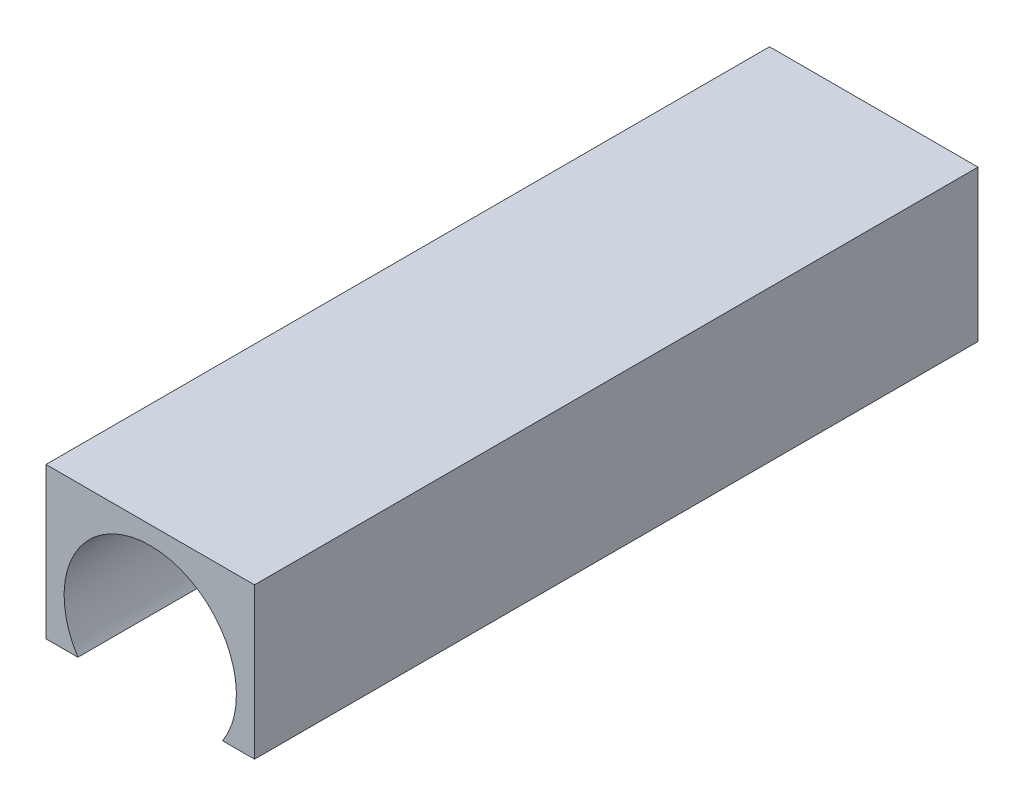
ISO-10303-21;
HEADER;
FILE_DESCRIPTION(('STEP AP214'),'2;1');
FILE_NAME('part.step','',(''),(''),'','','');
FILE_SCHEMA(('AUTOMOTIVE_DESIGN { 1 0 10303 214 1 1 1 1 }'));
ENDSEC;
DATA;
#1=APPLICATION_CONTEXT('core data for automotive mechanical design processes');
#2=APPLICATION_PROTOCOL_DEFINITION('international standard','automotive_design',2000,#1);
#3=PRODUCT_CONTEXT('',#1,'mechanical');
#4=PRODUCT('Part','Part','',(#3));
#5=PRODUCT_RELATED_PRODUCT_CATEGORY('part','',(#4));
#6=PRODUCT_DEFINITION_FORMATION('','',#4);
#7=PRODUCT_DEFINITION_CONTEXT('part definition',#1,'design');
#8=PRODUCT_DEFINITION('design','',#6,#7);
#9=PRODUCT_DEFINITION_SHAPE('','',#8);
#10=(LENGTH_UNIT() NAMED_UNIT(*) SI_UNIT(.MILLI.,.METRE.));
#11=(NAMED_UNIT(*) PLANE_ANGLE_UNIT() SI_UNIT($,.RADIAN.));
#12=(NAMED_UNIT(*) SI_UNIT($,.STERADIAN.) SOLID_ANGLE_UNIT());
#13=UNCERTAINTY_MEASURE_WITH_UNIT(LENGTH_MEASURE(1.E-05),#10,'distance_accuracy_value','');
#14=(GEOMETRIC_REPRESENTATION_CONTEXT(3) GLOBAL_UNCERTAINTY_ASSIGNED_CONTEXT((#13)) GLOBAL_UNIT_ASSIGNED_CONTEXT((#10,
#11,#12)) REPRESENTATION_CONTEXT('',''));
#15=CARTESIAN_POINT('',(0.,0.,0.));
#16=DIRECTION('',(0.,0.,1.));
#17=DIRECTION('',(1.,0.,0.));
#18=AXIS2_PLACEMENT_3D('',#15,#16,#17);
#19=CARTESIAN_POINT('',(0.,0.,12.7));
#20=DIRECTION('',(1.,0.,0.));
#21=DIRECTION('',(0.,0.,-1.));
#22=AXIS2_PLACEMENT_3D('',#19,#20,#21);
#23=PLANE('',#22);
#24=DIRECTION('',(0.,-1.,0.));
#25=VECTOR('',#24,1.);
#26=CARTESIAN_POINT('',(0.,0.,-12.7));
#27=LINE('',#26,#25);
#28=CARTESIAN_POINT('',(0.,5.30287096267479,-12.7));
#29=VERTEX_POINT('',#28);
#30=CARTESIAN_POINT('',(0.,0.,-12.7));
#31=VERTEX_POINT('',#30);
#32=EDGE_CURVE('E128',#29,#31,#27,.T.);
#33=ORIENTED_EDGE('',*,*,#32,.T.);
#34=DIRECTION('',(0.,0.,-1.));
#35=VECTOR('',#34,1.);
#36=CARTESIAN_POINT('',(0.,0.,12.7));
#37=LINE('',#36,#35);
#38=CARTESIAN_POINT('',(0.,0.,12.7));
#39=VERTEX_POINT('',#38);
#40=EDGE_CURVE('E11',#39,#31,#37,.T.);
#41=ORIENTED_EDGE('',*,*,#40,.F.);
#42=DIRECTION('',(0.,-1.,0.));
#43=VECTOR('',#42,1.);
#44=CARTESIAN_POINT('',(0.,0.,12.7));
#45=LINE('',#44,#43);
#46=CARTESIAN_POINT('',(0.,5.30287096267479,12.7));
#47=VERTEX_POINT('',#46);
#48=EDGE_CURVE('E144',#47,#39,#45,.T.);
#49=ORIENTED_EDGE('',*,*,#48,.F.);
#50=DIRECTION('',(0.,0.,-1.));
#51=VECTOR('',#50,1.);
#52=CARTESIAN_POINT('',(0.,5.30287096267479,12.7));
#53=LINE('',#52,#51);
#54=EDGE_CURVE('E124',#47,#29,#53,.T.);
#55=ORIENTED_EDGE('',*,*,#54,.T.);
#56=EDGE_LOOP('',(#33,#41,#49,#55));
#57=FACE_BOUND('',#56,.T.);
#58=ADVANCED_FACE('F39',(#57),#23,.F.);
#59=CARTESIAN_POINT('',(0.,0.,12.7));
#60=DIRECTION('',(0.,1.,0.));
#61=DIRECTION('',(0.,0.,1.));
#62=AXIS2_PLACEMENT_3D('',#59,#60,#61);
#63=PLANE('',#62);
#64=DIRECTION('',(1.,0.,0.));
#65=VECTOR('',#64,1.);
#66=CARTESIAN_POINT('',(0.,0.,-12.7));
#67=LINE('',#66,#65);
#68=CARTESIAN_POINT('',(1.12,0.,-12.7));
#69=VERTEX_POINT('',#68);
#70=EDGE_CURVE('E132',#31,#69,#67,.T.);
#71=ORIENTED_EDGE('',*,*,#70,.T.);
#72=DIRECTION('',(0.,0.,-1.));
#73=VECTOR('',#72,1.);
#74=CARTESIAN_POINT('',(1.12,0.,12.7));
#75=LINE('',#74,#73);
#76=CARTESIAN_POINT('',(1.12,0.,12.7));
#77=VERTEX_POINT('',#76);
#78=EDGE_CURVE('E48',#77,#69,#75,.T.);
#79=ORIENTED_EDGE('',*,*,#78,.F.);
#80=DIRECTION('',(1.,0.,0.));
#81=VECTOR('',#80,1.);
#82=CARTESIAN_POINT('',(0.,0.,12.7));
#83=LINE('',#82,#81);
#84=EDGE_CURVE('E93',#39,#77,#83,.T.);
#85=ORIENTED_EDGE('',*,*,#84,.F.);
#86=ORIENTED_EDGE('',*,*,#40,.T.);
#87=EDGE_LOOP('',(#71,#79,#85,#86));
#88=FACE_BOUND('',#87,.T.);
#89=ADVANCED_FACE('F172',(#88),#63,.F.);
#90=CARTESIAN_POINT('',(3.66,1.64287096267479,12.7));
#91=DIRECTION('',(0.,0.,-1.));
#92=DIRECTION('',(-1.,0.,0.));
#93=AXIS2_PLACEMENT_3D('',#90,#91,#92);
#94=CYLINDRICAL_SURFACE('',#93,3.025);
#95=CARTESIAN_POINT('',(3.66,1.64287096267479,-12.7));
#96=DIRECTION('',(0.,0.,-1.));
#97=DIRECTION('',(-1.,0.,0.));
#98=AXIS2_PLACEMENT_3D('',#95,#96,#97);
#99=CIRCLE('',#98,3.025);
#100=CARTESIAN_POINT('',(6.2,0.,-12.7));
#101=VERTEX_POINT('',#100);
#102=EDGE_CURVE('E135',#69,#101,#99,.T.);
#103=ORIENTED_EDGE('',*,*,#102,.T.);
#104=DIRECTION('',(0.,0.,-1.));
#105=VECTOR('',#104,1.);
#106=CARTESIAN_POINT('',(6.2,0.,12.7));
#107=LINE('',#106,#105);
#108=CARTESIAN_POINT('',(6.2,0.,12.7));
#109=VERTEX_POINT('',#108);
#110=EDGE_CURVE('E117',#109,#101,#107,.T.);
#111=ORIENTED_EDGE('',*,*,#110,.F.);
#112=CARTESIAN_POINT('',(3.66,1.64287096267479,12.7));
#113=DIRECTION('',(0.,0.,-1.));
#114=DIRECTION('',(-1.,0.,0.));
#115=AXIS2_PLACEMENT_3D('',#112,#113,#114);
#116=CIRCLE('',#115,3.025);
#117=EDGE_CURVE('E106',#77,#109,#116,.T.);
#118=ORIENTED_EDGE('',*,*,#117,.F.);
#119=ORIENTED_EDGE('',*,*,#78,.T.);
#120=EDGE_LOOP('',(#103,#111,#118,#119));
#121=FACE_BOUND('',#120,.T.);
#122=ADVANCED_FACE('F154',(#121),#94,.F.);
#123=CARTESIAN_POINT('',(6.2,0.,12.7));
#124=DIRECTION('',(0.,1.,0.));
#125=DIRECTION('',(0.,0.,1.));
#126=AXIS2_PLACEMENT_3D('',#123,#124,#125);
#127=PLANE('',#126);
#128=DIRECTION('',(1.,0.,0.));
#129=VECTOR('',#128,1.);
#130=CARTESIAN_POINT('',(6.2,0.,-12.7));
#131=LINE('',#130,#129);
#132=CARTESIAN_POINT('',(7.32,0.,-12.7));
#133=VERTEX_POINT('',#132);
#134=EDGE_CURVE('E115',#101,#133,#131,.T.);
#135=ORIENTED_EDGE('',*,*,#134,.T.);
#136=DIRECTION('',(0.,0.,-1.));
#137=VECTOR('',#136,1.);
#138=CARTESIAN_POINT('',(7.32,0.,12.7));
#139=LINE('',#138,#137);
#140=CARTESIAN_POINT('',(7.32,0.,12.7));
#141=VERTEX_POINT('',#140);
#142=EDGE_CURVE('E112',#141,#133,#139,.T.);
#143=ORIENTED_EDGE('',*,*,#142,.F.);
#144=DIRECTION('',(1.,0.,0.));
#145=VECTOR('',#144,1.);
#146=CARTESIAN_POINT('',(6.2,0.,12.7));
#147=LINE('',#146,#145);
#148=EDGE_CURVE('E100',#109,#141,#147,.T.);
#149=ORIENTED_EDGE('',*,*,#148,.F.);
#150=ORIENTED_EDGE('',*,*,#110,.T.);
#151=EDGE_LOOP('',(#135,#143,#149,#150));
#152=FACE_BOUND('',#151,.T.);
#153=ADVANCED_FACE('F113',(#152),#127,.F.);
#154=CARTESIAN_POINT('',(7.32,0.,12.7));
#155=DIRECTION('',(-1.,0.,0.));
#156=DIRECTION('',(0.,0.,1.));
#157=AXIS2_PLACEMENT_3D('',#154,#155,#156);
#158=PLANE('',#157);
#159=DIRECTION('',(0.,1.,0.));
#160=VECTOR('',#159,1.);
#161=CARTESIAN_POINT('',(7.32,0.,-12.7));
#162=LINE('',#161,#160);
#163=CARTESIAN_POINT('',(7.32,5.30287096267479,-12.7));
#164=VERTEX_POINT('',#163);
#165=EDGE_CURVE('E79',#133,#164,#162,.T.);
#166=ORIENTED_EDGE('',*,*,#165,.T.);
#167=DIRECTION('',(0.,0.,-1.));
#168=VECTOR('',#167,1.);
#169=CARTESIAN_POINT('',(7.32,5.30287096267479,12.7));
#170=LINE('',#169,#168);
#171=CARTESIAN_POINT('',(7.32,5.30287096267479,12.7));
#172=VERTEX_POINT('',#171);
#173=EDGE_CURVE('E118',#172,#164,#170,.T.);
#174=ORIENTED_EDGE('',*,*,#173,.F.);
#175=DIRECTION('',(0.,1.,0.));
#176=VECTOR('',#175,1.);
#177=CARTESIAN_POINT('',(7.32,0.,12.7));
#178=LINE('',#177,#176);
#179=EDGE_CURVE('E104',#141,#172,#178,.T.);
#180=ORIENTED_EDGE('',*,*,#179,.F.);
#181=ORIENTED_EDGE('',*,*,#142,.T.);
#182=EDGE_LOOP('',(#166,#174,#180,#181));
#183=FACE_BOUND('',#182,.T.);
#184=ADVANCED_FACE('F120',(#183),#158,.F.);
#185=CARTESIAN_POINT('',(0.,5.30287096267479,12.7));
#186=DIRECTION('',(0.,-1.,0.));
#187=DIRECTION('',(0.,0.,-1.));
#188=AXIS2_PLACEMENT_3D('',#185,#186,#187);
#189=PLANE('',#188);
#190=DIRECTION('',(-1.,0.,0.));
#191=VECTOR('',#190,1.);
#192=CARTESIAN_POINT('',(0.,5.30287096267479,-12.7));
#193=LINE('',#192,#191);
#194=EDGE_CURVE('E85',#164,#29,#193,.T.);
#195=ORIENTED_EDGE('',*,*,#194,.T.);
#196=ORIENTED_EDGE('',*,*,#54,.F.);
#197=DIRECTION('',(-1.,0.,0.));
#198=VECTOR('',#197,1.);
#199=CARTESIAN_POINT('',(0.,5.30287096267479,12.7));
#200=LINE('',#199,#198);
#201=EDGE_CURVE('E56',#172,#47,#200,.T.);
#202=ORIENTED_EDGE('',*,*,#201,.F.);
#203=ORIENTED_EDGE('',*,*,#173,.T.);
#204=EDGE_LOOP('',(#195,#196,#202,#203));
#205=FACE_BOUND('',#204,.T.);
#206=ADVANCED_FACE('F161',(#205),#189,.F.);
#207=CARTESIAN_POINT('',(3.66,1.64287096267479,12.7));
#208=DIRECTION('',(0.,0.,-1.));
#209=DIRECTION('',(-1.,0.,0.));
#210=AXIS2_PLACEMENT_3D('',#207,#208,#209);
#211=PLANE('',#210);
#212=ORIENTED_EDGE('',*,*,#48,.T.);
#213=ORIENTED_EDGE('',*,*,#84,.T.);
#214=ORIENTED_EDGE('',*,*,#117,.T.);
#215=ORIENTED_EDGE('',*,*,#148,.T.);
#216=ORIENTED_EDGE('',*,*,#179,.T.);
#217=ORIENTED_EDGE('',*,*,#201,.T.);
#218=EDGE_LOOP('',(#212,#213,#214,#215,#216,#217));
#219=FACE_BOUND('',#218,.T.);
#220=ADVANCED_FACE('F102',(#219),#211,.F.);
#221=CARTESIAN_POINT('',(3.66,1.64287096267479,-12.7));
#222=DIRECTION('',(0.,0.,-1.));
#223=DIRECTION('',(-1.,0.,0.));
#224=AXIS2_PLACEMENT_3D('',#221,#222,#223);
#225=PLANE('',#224);
#226=ORIENTED_EDGE('',*,*,#32,.F.);
#227=ORIENTED_EDGE('',*,*,#194,.F.);
#228=ORIENTED_EDGE('',*,*,#165,.F.);
#229=ORIENTED_EDGE('',*,*,#134,.F.);
#230=ORIENTED_EDGE('',*,*,#102,.F.);
#231=ORIENTED_EDGE('',*,*,#70,.F.);
#232=EDGE_LOOP('',(#226,#227,#228,#229,#230,#231));
#233=FACE_BOUND('',#232,.T.);
#234=ADVANCED_FACE('F157',(#233),#225,.T.);
#235=CLOSED_SHELL('',(#58,#89,#122,#153,#184,#206,#220,#234));
#236=MANIFOLD_SOLID_BREP('B2',#235);
#237=ADVANCED_BREP_SHAPE_REPRESENTATION('',(#18,#236),#14);
#238=SHAPE_DEFINITION_REPRESENTATION(#9,#237);
ENDSEC;
END-ISO-10303-21;
